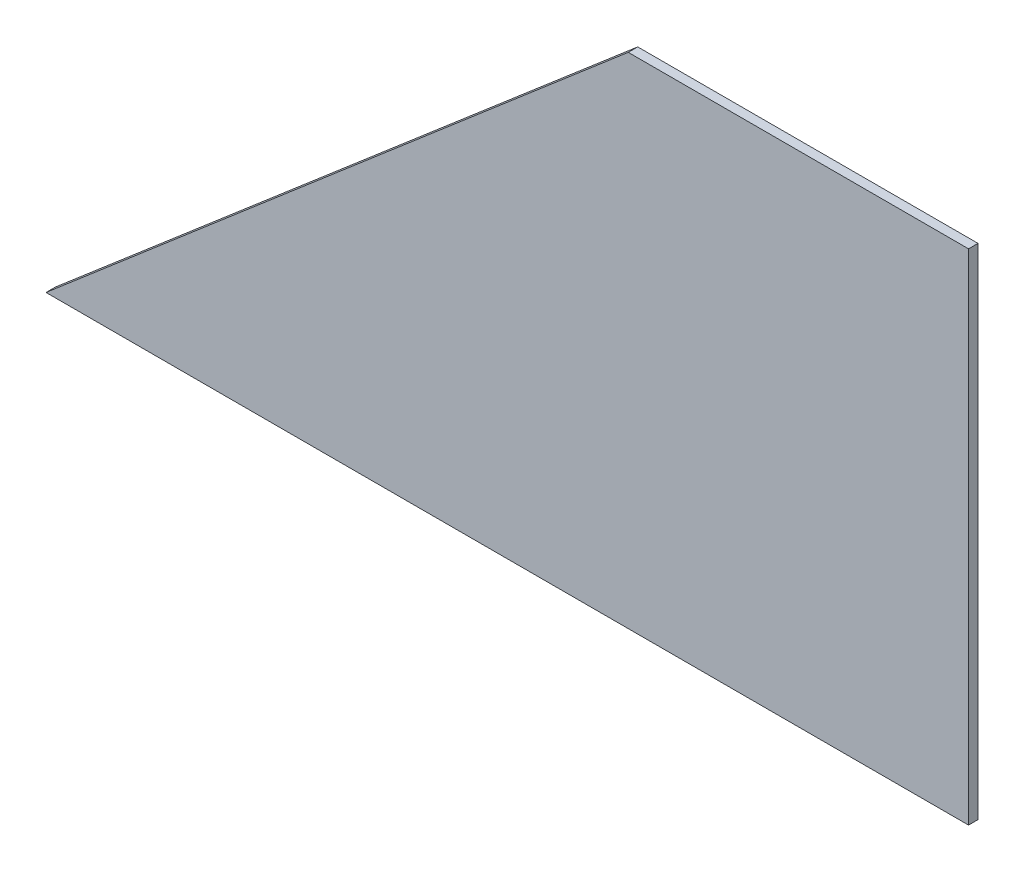
ISO-10303-21;
HEADER;
FILE_DESCRIPTION(('STEP AP214'),'2;1');
FILE_NAME('part.step','',(''),(''),'','','');
FILE_SCHEMA(('AUTOMOTIVE_DESIGN { 1 0 10303 214 1 1 1 1 }'));
ENDSEC;
DATA;
#1=APPLICATION_CONTEXT('core data for automotive mechanical design processes');
#2=APPLICATION_PROTOCOL_DEFINITION('international standard','automotive_design',2000,#1);
#3=PRODUCT_CONTEXT('',#1,'mechanical');
#4=PRODUCT('Part','Part','',(#3));
#5=PRODUCT_RELATED_PRODUCT_CATEGORY('part','',(#4));
#6=PRODUCT_DEFINITION_FORMATION('','',#4);
#7=PRODUCT_DEFINITION_CONTEXT('part definition',#1,'design');
#8=PRODUCT_DEFINITION('design','',#6,#7);
#9=PRODUCT_DEFINITION_SHAPE('','',#8);
#10=(LENGTH_UNIT() NAMED_UNIT(*) SI_UNIT(.MILLI.,.METRE.));
#11=(NAMED_UNIT(*) PLANE_ANGLE_UNIT() SI_UNIT($,.RADIAN.));
#12=(NAMED_UNIT(*) SI_UNIT($,.STERADIAN.) SOLID_ANGLE_UNIT());
#13=UNCERTAINTY_MEASURE_WITH_UNIT(LENGTH_MEASURE(1.E-05),#10,'distance_accuracy_value','');
#14=(GEOMETRIC_REPRESENTATION_CONTEXT(3) GLOBAL_UNCERTAINTY_ASSIGNED_CONTEXT((#13)) GLOBAL_UNIT_ASSIGNED_CONTEXT((#10,
#11,#12)) REPRESENTATION_CONTEXT('',''));
#15=CARTESIAN_POINT('',(0.,0.,0.));
#16=DIRECTION('',(0.,0.,1.));
#17=DIRECTION('',(1.,0.,0.));
#18=AXIS2_PLACEMENT_3D('',#15,#16,#17);
#19=CARTESIAN_POINT('',(347.8679657213,177.64,-26.9875));
#20=DIRECTION('',(1.,0.,0.));
#21=DIRECTION('',(0.,0.,-1.));
#22=AXIS2_PLACEMENT_3D('',#19,#20,#21);
#23=PLANE('',#22);
#24=DIRECTION('',(0.,0.,1.));
#25=VECTOR('',#24,1.);
#26=CARTESIAN_POINT('',(347.8679657213,177.64,-26.9875));
#27=LINE('',#26,#25);
#28=CARTESIAN_POINT('',(347.8679657213,177.64,-26.9875));
#29=VERTEX_POINT('',#28);
#30=CARTESIAN_POINT('',(347.8679657213,177.64,-23.8125));
#31=VERTEX_POINT('',#30);
#32=EDGE_CURVE('E50',#29,#31,#27,.T.);
#33=ORIENTED_EDGE('',*,*,#32,.T.);
#34=DIRECTION('',(0.,1.,0.));
#35=VECTOR('',#34,1.);
#36=CARTESIAN_POINT('',(347.8679657213,177.64,-23.8125));
#37=LINE('',#36,#35);
#38=CARTESIAN_POINT('',(347.8679657213,10.,-23.8125));
#39=VERTEX_POINT('',#38);
#40=EDGE_CURVE('E88',#39,#31,#37,.T.);
#41=ORIENTED_EDGE('',*,*,#40,.F.);
#42=DIRECTION('',(0.,0.,1.));
#43=VECTOR('',#42,1.);
#44=CARTESIAN_POINT('',(347.8679657213,10.,-26.9875));
#45=LINE('',#44,#43);
#46=CARTESIAN_POINT('',(347.8679657213,10.,-26.9875));
#47=VERTEX_POINT('',#46);
#48=EDGE_CURVE('E11',#47,#39,#45,.T.);
#49=ORIENTED_EDGE('',*,*,#48,.F.);
#50=DIRECTION('',(0.,1.,0.));
#51=VECTOR('',#50,1.);
#52=CARTESIAN_POINT('',(347.8679657213,177.64,-26.9875));
#53=LINE('',#52,#51);
#54=EDGE_CURVE('E89',#47,#29,#53,.T.);
#55=ORIENTED_EDGE('',*,*,#54,.T.);
#56=EDGE_LOOP('',(#33,#41,#49,#55));
#57=FACE_BOUND('',#56,.T.);
#58=ADVANCED_FACE('F47',(#57),#23,.T.);
#59=CARTESIAN_POINT('',(347.8679657213,10.,-26.9875));
#60=DIRECTION('',(0.,-1.,0.));
#61=DIRECTION('',(1.,0.,0.));
#62=AXIS2_PLACEMENT_3D('',#59,#60,#61);
#63=PLANE('',#62);
#64=ORIENTED_EDGE('',*,*,#48,.T.);
#65=DIRECTION('',(1.,0.,0.));
#66=VECTOR('',#65,1.);
#67=CARTESIAN_POINT('',(347.8679657213,10.,-23.8125));
#68=LINE('',#67,#66);
#69=CARTESIAN_POINT('',(37.9879657212996,10.,-23.8125));
#70=VERTEX_POINT('',#69);
#71=EDGE_CURVE('E107',#70,#39,#68,.T.);
#72=ORIENTED_EDGE('',*,*,#71,.F.);
#73=DIRECTION('',(0.,0.,1.));
#74=VECTOR('',#73,1.);
#75=CARTESIAN_POINT('',(37.9879657212996,10.,-26.9875));
#76=LINE('',#75,#74);
#77=CARTESIAN_POINT('',(37.9879657212996,10.,-26.9875));
#78=VERTEX_POINT('',#77);
#79=EDGE_CURVE('E56',#78,#70,#76,.T.);
#80=ORIENTED_EDGE('',*,*,#79,.F.);
#81=DIRECTION('',(1.,0.,0.));
#82=VECTOR('',#81,1.);
#83=CARTESIAN_POINT('',(347.8679657213,10.,-26.9875));
#84=LINE('',#83,#82);
#85=EDGE_CURVE('E95',#78,#47,#84,.T.);
#86=ORIENTED_EDGE('',*,*,#85,.T.);
#87=EDGE_LOOP('',(#64,#72,#80,#86));
#88=FACE_BOUND('',#87,.T.);
#89=ADVANCED_FACE('F131',(#88),#63,.T.);
#90=CARTESIAN_POINT('',(37.9879657212996,10.,-26.9875));
#91=DIRECTION('',(-0.650791373455968,0.759256602365296,0.));
#92=DIRECTION('',(-0.759256602365297,-0.650791373455969,0.));
#93=AXIS2_PLACEMENT_3D('',#90,#91,#92);
#94=PLANE('',#93);
#95=ORIENTED_EDGE('',*,*,#79,.T.);
#96=DIRECTION('',(-0.759256602365297,-0.650791373455969,0.));
#97=VECTOR('',#96,1.);
#98=CARTESIAN_POINT('',(37.9879657212996,10.,-23.8125));
#99=LINE('',#98,#97);
#100=CARTESIAN_POINT('',(233.5679657213,177.64,-23.8125));
#101=VERTEX_POINT('',#100);
#102=EDGE_CURVE('E103',#101,#70,#99,.T.);
#103=ORIENTED_EDGE('',*,*,#102,.F.);
#104=DIRECTION('',(0.,0.,1.));
#105=VECTOR('',#104,1.);
#106=CARTESIAN_POINT('',(233.5679657213,177.64,-26.9875));
#107=LINE('',#106,#105);
#108=CARTESIAN_POINT('',(233.5679657213,177.64,-26.9875));
#109=VERTEX_POINT('',#108);
#110=EDGE_CURVE('E94',#109,#101,#107,.T.);
#111=ORIENTED_EDGE('',*,*,#110,.F.);
#112=DIRECTION('',(-0.759256602365297,-0.650791373455969,0.));
#113=VECTOR('',#112,1.);
#114=CARTESIAN_POINT('',(37.9879657212996,10.,-26.9875));
#115=LINE('',#114,#113);
#116=EDGE_CURVE('E121',#109,#78,#115,.T.);
#117=ORIENTED_EDGE('',*,*,#116,.T.);
#118=EDGE_LOOP('',(#95,#103,#111,#117));
#119=FACE_BOUND('',#118,.T.);
#120=ADVANCED_FACE('F128',(#119),#94,.T.);
#121=CARTESIAN_POINT('',(233.5679657213,177.64,-26.9875));
#122=DIRECTION('',(0.,1.,0.));
#123=DIRECTION('',(0.,0.,1.));
#124=AXIS2_PLACEMENT_3D('',#121,#122,#123);
#125=PLANE('',#124);
#126=ORIENTED_EDGE('',*,*,#110,.T.);
#127=DIRECTION('',(-1.,0.,0.));
#128=VECTOR('',#127,1.);
#129=CARTESIAN_POINT('',(233.5679657213,177.64,-23.8125));
#130=LINE('',#129,#128);
#131=EDGE_CURVE('E97',#31,#101,#130,.T.);
#132=ORIENTED_EDGE('',*,*,#131,.F.);
#133=ORIENTED_EDGE('',*,*,#32,.F.);
#134=DIRECTION('',(-1.,0.,0.));
#135=VECTOR('',#134,1.);
#136=CARTESIAN_POINT('',(233.5679657213,177.64,-26.9875));
#137=LINE('',#136,#135);
#138=EDGE_CURVE('E118',#29,#109,#137,.T.);
#139=ORIENTED_EDGE('',*,*,#138,.T.);
#140=EDGE_LOOP('',(#126,#132,#133,#139));
#141=FACE_BOUND('',#140,.T.);
#142=ADVANCED_FACE('F98',(#141),#125,.T.);
#143=CARTESIAN_POINT('',(0.,0.,-26.9875));
#144=DIRECTION('',(0.,0.,-1.));
#145=DIRECTION('',(-1.,0.,0.));
#146=AXIS2_PLACEMENT_3D('',#143,#144,#145);
#147=PLANE('',#146);
#148=ORIENTED_EDGE('',*,*,#54,.F.);
#149=ORIENTED_EDGE('',*,*,#85,.F.);
#150=ORIENTED_EDGE('',*,*,#116,.F.);
#151=ORIENTED_EDGE('',*,*,#138,.F.);
#152=EDGE_LOOP('',(#148,#149,#150,#151));
#153=FACE_BOUND('',#152,.T.);
#154=ADVANCED_FACE('F133',(#153),#147,.T.);
#155=CARTESIAN_POINT('',(0.,0.,-23.8125));
#156=DIRECTION('',(0.,0.,-1.));
#157=DIRECTION('',(-1.,0.,0.));
#158=AXIS2_PLACEMENT_3D('',#155,#156,#157);
#159=PLANE('',#158);
#160=ORIENTED_EDGE('',*,*,#40,.T.);
#161=ORIENTED_EDGE('',*,*,#131,.T.);
#162=ORIENTED_EDGE('',*,*,#102,.T.);
#163=ORIENTED_EDGE('',*,*,#71,.T.);
#164=EDGE_LOOP('',(#160,#161,#162,#163));
#165=FACE_BOUND('',#164,.T.);
#166=ADVANCED_FACE('F106',(#165),#159,.F.);
#167=CLOSED_SHELL('',(#58,#89,#120,#142,#154,#166));
#168=MANIFOLD_SOLID_BREP('B2',#167);
#169=ADVANCED_BREP_SHAPE_REPRESENTATION('',(#18,#168),#14);
#170=SHAPE_DEFINITION_REPRESENTATION(#9,#169);
ENDSEC;
END-ISO-10303-21;
